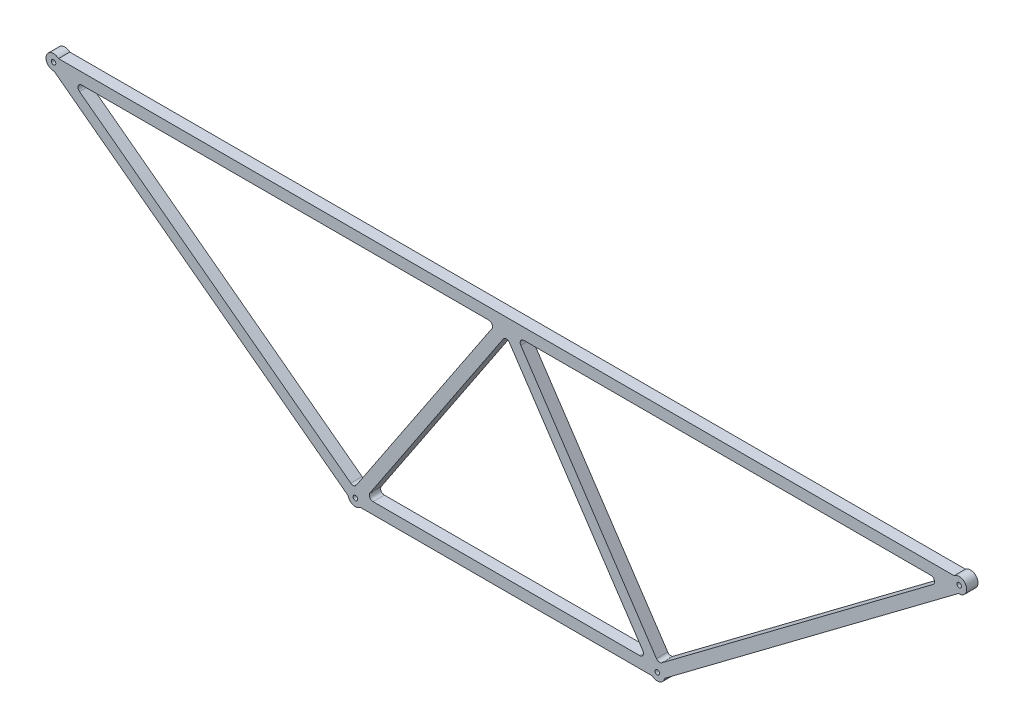
ISO-10303-21;
HEADER;
FILE_DESCRIPTION(('STEP AP214'),'2;1');
FILE_NAME('part.step','',(''),(''),'','','');
FILE_SCHEMA(('AUTOMOTIVE_DESIGN { 1 0 10303 214 1 1 1 1 }'));
ENDSEC;
DATA;
#1=APPLICATION_CONTEXT('core data for automotive mechanical design processes');
#2=APPLICATION_PROTOCOL_DEFINITION('international standard','automotive_design',2000,#1);
#3=PRODUCT_CONTEXT('',#1,'mechanical');
#4=PRODUCT('Part','Part','',(#3));
#5=PRODUCT_RELATED_PRODUCT_CATEGORY('part','',(#4));
#6=PRODUCT_DEFINITION_FORMATION('','',#4);
#7=PRODUCT_DEFINITION_CONTEXT('part definition',#1,'design');
#8=PRODUCT_DEFINITION('design','',#6,#7);
#9=PRODUCT_DEFINITION_SHAPE('','',#8);
#10=(LENGTH_UNIT() NAMED_UNIT(*) SI_UNIT(.MILLI.,.METRE.));
#11=(NAMED_UNIT(*) PLANE_ANGLE_UNIT() SI_UNIT($,.RADIAN.));
#12=(NAMED_UNIT(*) SI_UNIT($,.STERADIAN.) SOLID_ANGLE_UNIT());
#13=UNCERTAINTY_MEASURE_WITH_UNIT(LENGTH_MEASURE(1.E-05),#10,'distance_accuracy_value','');
#14=(GEOMETRIC_REPRESENTATION_CONTEXT(3) GLOBAL_UNCERTAINTY_ASSIGNED_CONTEXT((#13)) GLOBAL_UNIT_ASSIGNED_CONTEXT((#10,
#11,#12)) REPRESENTATION_CONTEXT('',''));
#15=CARTESIAN_POINT('',(0.,0.,0.));
#16=DIRECTION('',(0.,0.,1.));
#17=DIRECTION('',(1.,0.,0.));
#18=AXIS2_PLACEMENT_3D('',#15,#16,#17);
#19=CARTESIAN_POINT('',(204.5,-306.,7.5));
#20=DIRECTION('',(-0.600000000000043,0.799999999999968,0.));
#21=DIRECTION('',(-0.799999999999968,-0.600000000000043,0.));
#22=AXIS2_PLACEMENT_3D('',#19,#20,#21);
#23=PLANE('',#22);
#24=DIRECTION('',(0.,0.,-1.));
#25=VECTOR('',#24,1.);
#26=CARTESIAN_POINT('',(599.208497377831,-9.96862696659374,7.5));
#27=LINE('',#26,#25);
#28=CARTESIAN_POINT('',(599.208497377808,-9.9686269665919,7.5));
#29=VERTEX_POINT('',#28);
#30=CARTESIAN_POINT('',(599.208497377831,-9.96862696659372,-7.5));
#31=VERTEX_POINT('',#30);
#32=EDGE_CURVE('E222',#29,#31,#27,.T.);
#33=ORIENTED_EDGE('',*,*,#32,.F.);
#34=DIRECTION('',(0.799999999999949,0.600000000000067,0.));
#35=VECTOR('',#34,1.);
#36=CARTESIAN_POINT('',(204.5,-306.,7.5));
#37=LINE('',#36,#35);
#38=CARTESIAN_POINT('',(209.791502622129,-302.031373033402,7.5));
#39=VERTEX_POINT('',#38);
#40=EDGE_CURVE('E346',#39,#29,#37,.T.);
#41=ORIENTED_EDGE('',*,*,#40,.F.);
#42=DIRECTION('',(0.,0.,-1.));
#43=VECTOR('',#42,1.);
#44=CARTESIAN_POINT('',(209.791502622129,-302.031373033402,7.5));
#45=LINE('',#44,#43);
#46=CARTESIAN_POINT('',(209.791502622129,-302.031373033402,-7.5));
#47=VERTEX_POINT('',#46);
#48=EDGE_CURVE('E221',#47,#39,#45,.F.);
#49=ORIENTED_EDGE('',*,*,#48,.F.);
#50=DIRECTION('',(0.799999999999968,0.600000000000043,0.));
#51=VECTOR('',#50,1.);
#52=CARTESIAN_POINT('',(204.5,-306.,-7.5));
#53=LINE('',#52,#51);
#54=EDGE_CURVE('E218',#47,#31,#53,.T.);
#55=ORIENTED_EDGE('',*,*,#54,.T.);
#56=EDGE_LOOP('',(#33,#41,#49,#55));
#57=FACE_BOUND('',#56,.T.);
#58=ADVANCED_FACE('F44',(#57),#23,.F.);
#59=CARTESIAN_POINT('',(622.499999999983,7.50000000002226,7.5));
#60=DIRECTION('',(0.,-1.,0.));
#61=DIRECTION('',(1.,0.,0.));
#62=AXIS2_PLACEMENT_3D('',#59,#60,#61);
#63=PLANE('',#62);
#64=DIRECTION('',(0.,0.,-1.));
#65=VECTOR('',#64,1.);
#66=CARTESIAN_POINT('',(593.385621722363,7.50000000002174,7.5));
#67=LINE('',#66,#65);
#68=CARTESIAN_POINT('',(593.385621722363,7.50000000002174,-7.5));
#69=VERTEX_POINT('',#68);
#70=CARTESIAN_POINT('',(593.385621722363,7.50000000002174,7.5));
#71=VERTEX_POINT('',#70);
#72=EDGE_CURVE('E388',#69,#71,#67,.F.);
#73=ORIENTED_EDGE('',*,*,#72,.F.);
#74=DIRECTION('',(-1.,0.,0.));
#75=VECTOR('',#74,1.);
#76=CARTESIAN_POINT('',(622.499999999983,7.50000000002226,-7.5));
#77=LINE('',#76,#75);
#78=CARTESIAN_POINT('',(-593.385621722339,7.50000000000051,-7.5));
#79=VERTEX_POINT('',#78);
#80=EDGE_CURVE('E227',#69,#79,#77,.T.);
#81=ORIENTED_EDGE('',*,*,#80,.T.);
#82=DIRECTION('',(0.,0.,-1.));
#83=VECTOR('',#82,1.);
#84=CARTESIAN_POINT('',(-593.385621722339,7.50000000000051,7.5));
#85=LINE('',#84,#83);
#86=CARTESIAN_POINT('',(-593.385621722339,7.50000000000051,7.5));
#87=VERTEX_POINT('',#86);
#88=EDGE_CURVE('E379',#79,#87,#85,.F.);
#89=ORIENTED_EDGE('',*,*,#88,.T.);
#90=DIRECTION('',(-1.,0.,0.));
#91=VECTOR('',#90,1.);
#92=CARTESIAN_POINT('',(622.499999999983,7.50000000002226,7.5));
#93=LINE('',#92,#91);
#94=EDGE_CURVE('E354',#71,#87,#93,.T.);
#95=ORIENTED_EDGE('',*,*,#94,.F.);
#96=EDGE_LOOP('',(#73,#81,#89,#95));
#97=FACE_BOUND('',#96,.T.);
#98=ADVANCED_FACE('F567',(#97),#63,.F.);
#99=CARTESIAN_POINT('',(200.,-307.5,7.5));
#100=DIRECTION('',(0.,1.,0.));
#101=DIRECTION('',(-1.,0.,0.));
#102=AXIS2_PLACEMENT_3D('',#99,#100,#101);
#103=PLANE('',#102);
#104=DIRECTION('',(0.,0.,-1.));
#105=VECTOR('',#104,1.);
#106=CARTESIAN_POINT('',(193.385621722338,-307.5,7.5));
#107=LINE('',#106,#105);
#108=CARTESIAN_POINT('',(193.385621722339,-307.5,7.5));
#109=VERTEX_POINT('',#108);
#110=CARTESIAN_POINT('',(193.385621722338,-307.5,-7.5));
#111=VERTEX_POINT('',#110);
#112=EDGE_CURVE('E259',#109,#111,#107,.T.);
#113=ORIENTED_EDGE('',*,*,#112,.F.);
#114=DIRECTION('',(1.,0.,0.));
#115=VECTOR('',#114,1.);
#116=CARTESIAN_POINT('',(-200.,-307.5,7.5));
#117=LINE('',#116,#115);
#118=CARTESIAN_POINT('',(-193.385621722329,-307.499999999991,7.5));
#119=VERTEX_POINT('',#118);
#120=EDGE_CURVE('E359',#119,#109,#117,.T.);
#121=ORIENTED_EDGE('',*,*,#120,.F.);
#122=DIRECTION('',(0.,0.,-1.));
#123=VECTOR('',#122,1.);
#124=CARTESIAN_POINT('',(-193.385621722329,-307.499999999991,7.5));
#125=LINE('',#124,#123);
#126=CARTESIAN_POINT('',(-193.385621722329,-307.499999999991,-7.5));
#127=VERTEX_POINT('',#126);
#128=EDGE_CURVE('E383',#127,#119,#125,.F.);
#129=ORIENTED_EDGE('',*,*,#128,.F.);
#130=DIRECTION('',(1.,0.,0.));
#131=VECTOR('',#130,1.);
#132=CARTESIAN_POINT('',(200.,-307.5,-7.5));
#133=LINE('',#132,#131);
#134=EDGE_CURVE('E351',#127,#111,#133,.T.);
#135=ORIENTED_EDGE('',*,*,#134,.T.);
#136=EDGE_LOOP('',(#113,#121,#129,#135));
#137=FACE_BOUND('',#136,.T.);
#138=ADVANCED_FACE('F574',(#137),#103,.F.);
#139=CARTESIAN_POINT('',(-204.5,-306.,7.5));
#140=DIRECTION('',(0.600000000000002,0.799999999999999,0.));
#141=DIRECTION('',(-0.799999999999999,0.600000000000002,0.));
#142=AXIS2_PLACEMENT_3D('',#139,#140,#141);
#143=PLANE('',#142);
#144=DIRECTION('',(0.,0.,-1.));
#145=VECTOR('',#144,1.);
#146=CARTESIAN_POINT('',(-209.791502622129,-302.031373033403,7.5));
#147=LINE('',#146,#145);
#148=CARTESIAN_POINT('',(-209.791502622129,-302.031373033403,7.5));
#149=VERTEX_POINT('',#148);
#150=CARTESIAN_POINT('',(-209.791502622129,-302.031373033403,-7.5));
#151=VERTEX_POINT('',#150);
#152=EDGE_CURVE('E271',#149,#151,#147,.T.);
#153=ORIENTED_EDGE('',*,*,#152,.F.);
#154=DIRECTION('',(0.8,-0.6,0.));
#155=VECTOR('',#154,1.);
#156=CARTESIAN_POINT('',(-622.5,7.49999999999999,7.5));
#157=LINE('',#156,#155);
#158=CARTESIAN_POINT('',(-599.208497377869,-9.96862696659684,7.5));
#159=VERTEX_POINT('',#158);
#160=EDGE_CURVE('E352',#159,#149,#157,.T.);
#161=ORIENTED_EDGE('',*,*,#160,.F.);
#162=DIRECTION('',(0.,0.,-1.));
#163=VECTOR('',#162,1.);
#164=CARTESIAN_POINT('',(-599.208497377869,-9.96862696659683,7.5));
#165=LINE('',#164,#163);
#166=CARTESIAN_POINT('',(-599.208497377869,-9.96862696659678,-7.5));
#167=VERTEX_POINT('',#166);
#168=EDGE_CURVE('E372',#159,#167,#165,.T.);
#169=ORIENTED_EDGE('',*,*,#168,.T.);
#170=DIRECTION('',(0.799999999999999,-0.600000000000002,0.));
#171=VECTOR('',#170,1.);
#172=CARTESIAN_POINT('',(-204.5,-306.,-7.5));
#173=LINE('',#172,#171);
#174=EDGE_CURVE('E368',#167,#151,#173,.T.);
#175=ORIENTED_EDGE('',*,*,#174,.T.);
#176=EDGE_LOOP('',(#153,#161,#169,#175));
#177=FACE_BOUND('',#176,.T.);
#178=ADVANCED_FACE('F588',(#177),#143,.F.);
#179=CARTESIAN_POINT('',(-600.,0.,7.5));
#180=DIRECTION('',(0.,0.,-1.));
#181=DIRECTION('',(-1.,0.,0.));
#182=AXIS2_PLACEMENT_3D('',#179,#180,#181);
#183=CYLINDRICAL_SURFACE('',#182,9.99999999999998);
#184=CARTESIAN_POINT('',(-600.,0.,-7.5));
#185=DIRECTION('',(0.,0.,1.));
#186=DIRECTION('',(1.,0.,0.));
#187=AXIS2_PLACEMENT_3D('',#184,#185,#186);
#188=CIRCLE('',#187,9.99999999999998);
#189=EDGE_CURVE('E362',#79,#167,#188,.T.);
#190=ORIENTED_EDGE('',*,*,#189,.T.);
#191=ORIENTED_EDGE('',*,*,#168,.F.);
#192=CARTESIAN_POINT('',(-600.,0.,7.5));
#193=DIRECTION('',(0.,0.,1.));
#194=DIRECTION('',(1.,0.,0.));
#195=AXIS2_PLACEMENT_3D('',#192,#193,#194);
#196=CIRCLE('',#195,9.99999999999998);
#197=EDGE_CURVE('E371',#87,#159,#196,.T.);
#198=ORIENTED_EDGE('',*,*,#197,.F.);
#199=ORIENTED_EDGE('',*,*,#88,.F.);
#200=EDGE_LOOP('',(#190,#191,#198,#199));
#201=FACE_BOUND('',#200,.T.);
#202=ADVANCED_FACE('F578',(#201),#183,.T.);
#203=CARTESIAN_POINT('',(-600.,0.,7.5));
#204=DIRECTION('',(0.,0.,1.));
#205=DIRECTION('',(1.,0.,0.));
#206=AXIS2_PLACEMENT_3D('',#203,#204,#205);
#207=PLANE('',#206);
#208=ORIENTED_EDGE('',*,*,#197,.T.);
#209=ORIENTED_EDGE('',*,*,#160,.T.);
#210=CARTESIAN_POINT('',(-200.,-300.,7.5));
#211=DIRECTION('',(0.,0.,1.));
#212=DIRECTION('',(1.,0.,0.));
#213=AXIS2_PLACEMENT_3D('',#210,#211,#212);
#214=CIRCLE('',#213,10.);
#215=EDGE_CURVE('E266',#149,#119,#214,.T.);
#216=ORIENTED_EDGE('',*,*,#215,.T.);
#217=ORIENTED_EDGE('',*,*,#120,.T.);
#218=CARTESIAN_POINT('',(200.,-300.,7.5));
#219=DIRECTION('',(0.,0.,1.));
#220=DIRECTION('',(1.,0.,0.));
#221=AXIS2_PLACEMENT_3D('',#218,#219,#220);
#222=CIRCLE('',#221,10.);
#223=EDGE_CURVE('E244',#109,#39,#222,.T.);
#224=ORIENTED_EDGE('',*,*,#223,.T.);
#225=ORIENTED_EDGE('',*,*,#40,.T.);
#226=CARTESIAN_POINT('',(600.,0.,7.5));
#227=DIRECTION('',(0.,0.,1.));
#228=DIRECTION('',(1.,0.,0.));
#229=AXIS2_PLACEMENT_3D('',#226,#227,#228);
#230=CIRCLE('',#229,9.99999999999998);
#231=EDGE_CURVE('E239',#29,#71,#230,.T.);
#232=ORIENTED_EDGE('',*,*,#231,.T.);
#233=ORIENTED_EDGE('',*,*,#94,.T.);
#234=EDGE_LOOP('',(#208,#209,#216,#217,#224,#225,#232,#233));
#235=FACE_BOUND('',#234,.T.);
#236=CARTESIAN_POINT('',(600.,0.,7.5));
#237=DIRECTION('',(0.,0.,1.));
#238=DIRECTION('',(1.,0.,0.));
#239=AXIS2_PLACEMENT_3D('',#236,#237,#238);
#240=CIRCLE('',#239,3.00000000000005);
#241=CARTESIAN_POINT('',(603.,0.,7.5));
#242=VERTEX_POINT('',#241);
#243=EDGE_CURVE('E253',#242,#242,#240,.T.);
#244=ORIENTED_EDGE('',*,*,#243,.F.);
#245=EDGE_LOOP('',(#244));
#246=FACE_BOUND('',#245,.T.);
#247=CARTESIAN_POINT('',(200.,-300.,7.5));
#248=DIRECTION('',(0.,0.,1.));
#249=DIRECTION('',(1.,0.,0.));
#250=AXIS2_PLACEMENT_3D('',#247,#248,#249);
#251=CIRCLE('',#250,3.00000000000002);
#252=CARTESIAN_POINT('',(203.,-300.,7.5));
#253=VERTEX_POINT('',#252);
#254=EDGE_CURVE('E410',#253,#253,#251,.T.);
#255=ORIENTED_EDGE('',*,*,#254,.F.);
#256=EDGE_LOOP('',(#255));
#257=FACE_BOUND('',#256,.T.);
#258=CARTESIAN_POINT('',(-200.,-300.,7.5));
#259=DIRECTION('',(0.,0.,1.));
#260=DIRECTION('',(1.,0.,0.));
#261=AXIS2_PLACEMENT_3D('',#258,#259,#260);
#262=CIRCLE('',#261,3.00000000000002);
#263=CARTESIAN_POINT('',(-197.,-300.,7.5));
#264=VERTEX_POINT('',#263);
#265=EDGE_CURVE('E401',#264,#264,#262,.T.);
#266=ORIENTED_EDGE('',*,*,#265,.F.);
#267=EDGE_LOOP('',(#266));
#268=FACE_BOUND('',#267,.T.);
#269=CARTESIAN_POINT('',(-600.,0.,7.5));
#270=DIRECTION('',(0.,0.,1.));
#271=DIRECTION('',(1.,0.,0.));
#272=AXIS2_PLACEMENT_3D('',#269,#270,#271);
#273=CIRCLE('',#272,2.99999999999994);
#274=CARTESIAN_POINT('',(-597.,0.,7.5));
#275=VERTEX_POINT('',#274);
#276=EDGE_CURVE('E398',#275,#275,#273,.T.);
#277=ORIENTED_EDGE('',*,*,#276,.F.);
#278=EDGE_LOOP('',(#277));
#279=FACE_BOUND('',#278,.T.);
#280=DIRECTION('',(0.8,-0.6,0.));
#281=VECTOR('',#280,1.);
#282=CARTESIAN_POINT('',(-577.5,-7.50000000000001,7.5));
#283=LINE('',#282,#281);
#284=CARTESIAN_POINT('',(-565.5,-16.5,7.5));
#285=VERTEX_POINT('',#284);
#286=CARTESIAN_POINT('',(-206.070975765178,-286.071768176117,7.5));
#287=VERTEX_POINT('',#286);
#288=EDGE_CURVE('E285',#285,#287,#283,.T.);
#289=ORIENTED_EDGE('',*,*,#288,.F.);
#290=CARTESIAN_POINT('',(-562.5,-12.5,7.5));
#291=DIRECTION('',(0.,0.,1.));
#292=DIRECTION('',(1.,0.,0.));
#293=AXIS2_PLACEMENT_3D('',#290,#291,#292);
#294=CIRCLE('',#293,5.);
#295=CARTESIAN_POINT('',(-562.5,-7.5,7.5));
#296=VERTEX_POINT('',#295);
#297=EDGE_CURVE('E480',#285,#296,#294,.F.);
#298=ORIENTED_EDGE('',*,*,#297,.T.);
#299=DIRECTION('',(-1.,0.,0.));
#300=VECTOR('',#299,1.);
#301=CARTESIAN_POINT('',(-14.0138781886598,-7.49999999999993,7.5));
#302=LINE('',#301,#300);
#303=CARTESIAN_POINT('',(-23.3564636477664,-7.49999999999993,7.5));
#304=VERTEX_POINT('',#303);
#305=EDGE_CURVE('E276',#304,#296,#302,.T.);
#306=ORIENTED_EDGE('',*,*,#305,.F.);
#307=CARTESIAN_POINT('',(-23.3564636477664,-12.4999999999999,7.5));
#308=DIRECTION('',(0.,0.,1.));
#309=DIRECTION('',(1.,0.,0.));
#310=AXIS2_PLACEMENT_3D('',#307,#308,#309);
#311=CIRCLE('',#310,5.);
#312=CARTESIAN_POINT('',(-19.1962121760772,-15.2735009811261,7.5));
#313=VERTEX_POINT('',#312);
#314=EDGE_CURVE('E494',#304,#313,#311,.F.);
#315=ORIENTED_EDGE('',*,*,#314,.T.);
#316=DIRECTION('',(0.554700196225229,0.832050294337844,0.));
#317=VECTOR('',#316,1.);
#318=CARTESIAN_POINT('',(-201.842585459107,-289.24306090567,7.5));
#319=LINE('',#318,#317);
#320=CARTESIAN_POINT('',(-198.910724293488,-284.845269157243,7.5));
#321=VERTEX_POINT('',#320);
#322=EDGE_CURVE('E288',#321,#313,#319,.T.);
#323=ORIENTED_EDGE('',*,*,#322,.F.);
#324=CARTESIAN_POINT('',(-203.070975765178,-282.071768176117,7.5));
#325=DIRECTION('',(0.,0.,1.));
#326=DIRECTION('',(1.,0.,0.));
#327=AXIS2_PLACEMENT_3D('',#324,#325,#326);
#328=CIRCLE('',#327,5.);
#329=EDGE_CURVE('E11',#321,#287,#328,.F.);
#330=ORIENTED_EDGE('',*,*,#329,.T.);
#331=EDGE_LOOP('',(#289,#298,#306,#315,#323,#330));
#332=FACE_BOUND('',#331,.T.);
#333=DIRECTION('',(0.554700196225229,-0.832050294337844,0.));
#334=VECTOR('',#333,1.);
#335=CARTESIAN_POINT('',(14.0138781886598,-7.49999999999995,7.5));
#336=LINE('',#335,#334);
#337=CARTESIAN_POINT('',(19.1962121760772,-15.2735009811261,7.5));
#338=VERTEX_POINT('',#337);
#339=CARTESIAN_POINT('',(198.910724293488,-284.845269157243,7.5));
#340=VERTEX_POINT('',#339);
#341=EDGE_CURVE('E307',#338,#340,#336,.T.);
#342=ORIENTED_EDGE('',*,*,#341,.F.);
#343=CARTESIAN_POINT('',(23.3564636477664,-12.5,7.5));
#344=DIRECTION('',(0.,0.,1.));
#345=DIRECTION('',(1.,0.,0.));
#346=AXIS2_PLACEMENT_3D('',#343,#344,#345);
#347=CIRCLE('',#346,5.);
#348=CARTESIAN_POINT('',(23.3564636477664,-7.49999999999995,7.5));
#349=VERTEX_POINT('',#348);
#350=EDGE_CURVE('E487',#338,#349,#347,.F.);
#351=ORIENTED_EDGE('',*,*,#350,.T.);
#352=DIRECTION('',(-1.,0.,0.));
#353=VECTOR('',#352,1.);
#354=CARTESIAN_POINT('',(577.5,-7.50000000000001,7.5));
#355=LINE('',#354,#353);
#356=CARTESIAN_POINT('',(562.5,-7.5,7.5));
#357=VERTEX_POINT('',#356);
#358=EDGE_CURVE('E303',#357,#349,#355,.T.);
#359=ORIENTED_EDGE('',*,*,#358,.F.);
#360=CARTESIAN_POINT('',(562.5,-12.5,7.5));
#361=DIRECTION('',(0.,0.,1.));
#362=DIRECTION('',(1.,0.,0.));
#363=AXIS2_PLACEMENT_3D('',#360,#361,#362);
#364=CIRCLE('',#363,5.);
#365=CARTESIAN_POINT('',(565.5,-16.5,7.5));
#366=VERTEX_POINT('',#365);
#367=EDGE_CURVE('E483',#357,#366,#364,.F.);
#368=ORIENTED_EDGE('',*,*,#367,.T.);
#369=DIRECTION('',(0.8,0.6,0.));
#370=VECTOR('',#369,1.);
#371=CARTESIAN_POINT('',(201.842585459107,-289.24306090567,7.5));
#372=LINE('',#371,#370);
#373=CARTESIAN_POINT('',(206.070975765178,-286.071768176117,7.5));
#374=VERTEX_POINT('',#373);
#375=EDGE_CURVE('E315',#374,#366,#372,.T.);
#376=ORIENTED_EDGE('',*,*,#375,.F.);
#377=CARTESIAN_POINT('',(203.070975765178,-282.071768176117,7.5));
#378=DIRECTION('',(0.,0.,1.));
#379=DIRECTION('',(1.,0.,0.));
#380=AXIS2_PLACEMENT_3D('',#377,#378,#379);
#381=CIRCLE('',#380,5.);
#382=EDGE_CURVE('E515',#374,#340,#381,.F.);
#383=ORIENTED_EDGE('',*,*,#382,.T.);
#384=EDGE_LOOP('',(#342,#351,#359,#368,#376,#383));
#385=FACE_BOUND('',#384,.T.);
#386=DIRECTION('',(-0.554700196225229,-0.832050294337844,0.));
#387=VECTOR('',#386,1.);
#388=CARTESIAN_POINT('',(-185.98612181134,-292.5,7.5));
#389=LINE('',#388,#387);
#390=CARTESIAN_POINT('',(-4.16025147168927,-19.7611944905239,7.5));
#391=VERTEX_POINT('',#390);
#392=CARTESIAN_POINT('',(-180.803787823923,-284.726499018874,7.5));
#393=VERTEX_POINT('',#392);
#394=EDGE_CURVE('E332',#391,#393,#389,.T.);
#395=ORIENTED_EDGE('',*,*,#394,.F.);
#396=CARTESIAN_POINT('',(0.,-22.53469547165,7.5));
#397=DIRECTION('',(0.,0.,1.));
#398=DIRECTION('',(1.,0.,0.));
#399=AXIS2_PLACEMENT_3D('',#396,#397,#398);
#400=CIRCLE('',#399,5.);
#401=CARTESIAN_POINT('',(4.16025147168923,-19.7611944905238,7.5));
#402=VERTEX_POINT('',#401);
#403=EDGE_CURVE('E504',#391,#402,#400,.F.);
#404=ORIENTED_EDGE('',*,*,#403,.T.);
#405=DIRECTION('',(-0.554700196225229,0.832050294337844,0.));
#406=VECTOR('',#405,1.);
#407=CARTESIAN_POINT('',(0.,-13.52081728299,7.5));
#408=LINE('',#407,#406);
#409=CARTESIAN_POINT('',(180.803787823923,-284.726499018874,7.5));
#410=VERTEX_POINT('',#409);
#411=EDGE_CURVE('E330',#410,#402,#408,.T.);
#412=ORIENTED_EDGE('',*,*,#411,.F.);
#413=CARTESIAN_POINT('',(176.643536352233,-287.5,7.5));
#414=DIRECTION('',(0.,0.,1.));
#415=DIRECTION('',(1.,0.,0.));
#416=AXIS2_PLACEMENT_3D('',#413,#414,#415);
#417=CIRCLE('',#416,5.);
#418=CARTESIAN_POINT('',(176.643536352233,-292.5,7.5));
#419=VERTEX_POINT('',#418);
#420=EDGE_CURVE('E64',#410,#419,#417,.F.);
#421=ORIENTED_EDGE('',*,*,#420,.T.);
#422=DIRECTION('',(1.,0.,0.));
#423=VECTOR('',#422,1.);
#424=CARTESIAN_POINT('',(-185.98612181134,-292.5,7.5));
#425=LINE('',#424,#423);
#426=CARTESIAN_POINT('',(-176.643536352233,-292.5,7.5));
#427=VERTEX_POINT('',#426);
#428=EDGE_CURVE('E232',#427,#419,#425,.T.);
#429=ORIENTED_EDGE('',*,*,#428,.F.);
#430=CARTESIAN_POINT('',(-176.643536352233,-287.5,7.5));
#431=DIRECTION('',(0.,0.,1.));
#432=DIRECTION('',(1.,0.,0.));
#433=AXIS2_PLACEMENT_3D('',#430,#431,#432);
#434=CIRCLE('',#433,5.);
#435=EDGE_CURVE('E520',#427,#393,#434,.F.);
#436=ORIENTED_EDGE('',*,*,#435,.T.);
#437=EDGE_LOOP('',(#395,#404,#412,#421,#429,#436));
#438=FACE_BOUND('',#437,.T.);
#439=ADVANCED_FACE('F534',(#235,#246,#257,#268,#279,#332,#385,#438),#207,.T.);
#440=CARTESIAN_POINT('',(-600.,0.,-7.5));
#441=DIRECTION('',(0.,0.,1.));
#442=DIRECTION('',(1.,0.,0.));
#443=AXIS2_PLACEMENT_3D('',#440,#441,#442);
#444=PLANE('',#443);
#445=CARTESIAN_POINT('',(600.,0.,-7.5));
#446=DIRECTION('',(0.,0.,1.));
#447=DIRECTION('',(1.,0.,0.));
#448=AXIS2_PLACEMENT_3D('',#445,#446,#447);
#449=CIRCLE('',#448,3.00000000000005);
#450=CARTESIAN_POINT('',(603.,0.,-7.5));
#451=VERTEX_POINT('',#450);
#452=EDGE_CURVE('E408',#451,#451,#449,.T.);
#453=ORIENTED_EDGE('',*,*,#452,.T.);
#454=EDGE_LOOP('',(#453));
#455=FACE_BOUND('',#454,.T.);
#456=CARTESIAN_POINT('',(200.,-300.,-7.5));
#457=DIRECTION('',(0.,0.,1.));
#458=DIRECTION('',(1.,0.,0.));
#459=AXIS2_PLACEMENT_3D('',#456,#457,#458);
#460=CIRCLE('',#459,3.00000000000002);
#461=CARTESIAN_POINT('',(203.,-300.,-7.5));
#462=VERTEX_POINT('',#461);
#463=EDGE_CURVE('E404',#462,#462,#460,.T.);
#464=ORIENTED_EDGE('',*,*,#463,.T.);
#465=EDGE_LOOP('',(#464));
#466=FACE_BOUND('',#465,.T.);
#467=CARTESIAN_POINT('',(-200.,-300.,-7.5));
#468=DIRECTION('',(0.,0.,1.));
#469=DIRECTION('',(1.,0.,0.));
#470=AXIS2_PLACEMENT_3D('',#467,#468,#469);
#471=CIRCLE('',#470,3.00000000000002);
#472=CARTESIAN_POINT('',(-197.,-300.,-7.5));
#473=VERTEX_POINT('',#472);
#474=EDGE_CURVE('E399',#473,#473,#471,.T.);
#475=ORIENTED_EDGE('',*,*,#474,.T.);
#476=EDGE_LOOP('',(#475));
#477=FACE_BOUND('',#476,.T.);
#478=CARTESIAN_POINT('',(-600.,0.,-7.5));
#479=DIRECTION('',(0.,0.,1.));
#480=DIRECTION('',(1.,0.,0.));
#481=AXIS2_PLACEMENT_3D('',#478,#479,#480);
#482=CIRCLE('',#481,2.99999999999994);
#483=CARTESIAN_POINT('',(-597.,0.,-7.5));
#484=VERTEX_POINT('',#483);
#485=EDGE_CURVE('E393',#484,#484,#482,.T.);
#486=ORIENTED_EDGE('',*,*,#485,.T.);
#487=EDGE_LOOP('',(#486));
#488=FACE_BOUND('',#487,.T.);
#489=ORIENTED_EDGE('',*,*,#174,.F.);
#490=ORIENTED_EDGE('',*,*,#189,.F.);
#491=ORIENTED_EDGE('',*,*,#80,.F.);
#492=CARTESIAN_POINT('',(600.,0.,-7.5));
#493=DIRECTION('',(0.,0.,1.));
#494=DIRECTION('',(1.,0.,0.));
#495=AXIS2_PLACEMENT_3D('',#492,#493,#494);
#496=CIRCLE('',#495,9.99999999999998);
#497=EDGE_CURVE('E240',#31,#69,#496,.T.);
#498=ORIENTED_EDGE('',*,*,#497,.F.);
#499=ORIENTED_EDGE('',*,*,#54,.F.);
#500=CARTESIAN_POINT('',(200.,-300.,-7.5));
#501=DIRECTION('',(0.,0.,1.));
#502=DIRECTION('',(1.,0.,0.));
#503=AXIS2_PLACEMENT_3D('',#500,#501,#502);
#504=CIRCLE('',#503,10.);
#505=EDGE_CURVE('E258',#111,#47,#504,.T.);
#506=ORIENTED_EDGE('',*,*,#505,.F.);
#507=ORIENTED_EDGE('',*,*,#134,.F.);
#508=CARTESIAN_POINT('',(-200.,-300.,-7.5));
#509=DIRECTION('',(0.,0.,1.));
#510=DIRECTION('',(1.,0.,0.));
#511=AXIS2_PLACEMENT_3D('',#508,#509,#510);
#512=CIRCLE('',#511,10.);
#513=EDGE_CURVE('E270',#151,#127,#512,.T.);
#514=ORIENTED_EDGE('',*,*,#513,.F.);
#515=EDGE_LOOP('',(#489,#490,#491,#498,#499,#506,#507,#514));
#516=FACE_BOUND('',#515,.T.);
#517=DIRECTION('',(0.554700196225229,0.832050294337844,0.));
#518=VECTOR('',#517,1.);
#519=CARTESIAN_POINT('',(-201.842585459107,-289.24306090567,-7.5));
#520=LINE('',#519,#518);
#521=CARTESIAN_POINT('',(-198.910724293488,-284.845269157243,-7.5));
#522=VERTEX_POINT('',#521);
#523=CARTESIAN_POINT('',(-19.1962121760772,-15.2735009811261,-7.5));
#524=VERTEX_POINT('',#523);
#525=EDGE_CURVE('E283',#522,#524,#520,.T.);
#526=ORIENTED_EDGE('',*,*,#525,.T.);
#527=CARTESIAN_POINT('',(-23.3564636477664,-12.4999999999999,-7.5));
#528=DIRECTION('',(0.,0.,1.));
#529=DIRECTION('',(1.,0.,0.));
#530=AXIS2_PLACEMENT_3D('',#527,#528,#529);
#531=CIRCLE('',#530,5.);
#532=CARTESIAN_POINT('',(-23.3564636477664,-7.49999999999993,-7.5));
#533=VERTEX_POINT('',#532);
#534=EDGE_CURVE('E495',#524,#533,#531,.T.);
#535=ORIENTED_EDGE('',*,*,#534,.T.);
#536=DIRECTION('',(-1.,0.,0.));
#537=VECTOR('',#536,1.);
#538=CARTESIAN_POINT('',(-14.0138781886598,-7.49999999999993,-7.5));
#539=LINE('',#538,#537);
#540=CARTESIAN_POINT('',(-562.5,-7.5,-7.5));
#541=VERTEX_POINT('',#540);
#542=EDGE_CURVE('E279',#533,#541,#539,.T.);
#543=ORIENTED_EDGE('',*,*,#542,.T.);
#544=CARTESIAN_POINT('',(-562.5,-12.5,-7.5));
#545=DIRECTION('',(0.,0.,1.));
#546=DIRECTION('',(1.,0.,0.));
#547=AXIS2_PLACEMENT_3D('',#544,#545,#546);
#548=CIRCLE('',#547,5.);
#549=CARTESIAN_POINT('',(-565.5,-16.5,-7.5));
#550=VERTEX_POINT('',#549);
#551=EDGE_CURVE('E475',#541,#550,#548,.T.);
#552=ORIENTED_EDGE('',*,*,#551,.T.);
#553=DIRECTION('',(0.8,-0.6,0.));
#554=VECTOR('',#553,1.);
#555=CARTESIAN_POINT('',(-577.5,-7.50000000000001,-7.5));
#556=LINE('',#555,#554);
#557=CARTESIAN_POINT('',(-206.070975765178,-286.071768176117,-7.5));
#558=VERTEX_POINT('',#557);
#559=EDGE_CURVE('E299',#550,#558,#556,.T.);
#560=ORIENTED_EDGE('',*,*,#559,.T.);
#561=CARTESIAN_POINT('',(-203.070975765178,-282.071768176117,-7.5));
#562=DIRECTION('',(0.,0.,1.));
#563=DIRECTION('',(1.,0.,0.));
#564=AXIS2_PLACEMENT_3D('',#561,#562,#563);
#565=CIRCLE('',#564,5.);
#566=EDGE_CURVE('E53',#558,#522,#565,.T.);
#567=ORIENTED_EDGE('',*,*,#566,.T.);
#568=EDGE_LOOP('',(#526,#535,#543,#552,#560,#567));
#569=FACE_BOUND('',#568,.T.);
#570=DIRECTION('',(1.,0.,0.));
#571=VECTOR('',#570,1.);
#572=CARTESIAN_POINT('',(-185.98612181134,-292.5,-7.5));
#573=LINE('',#572,#571);
#574=CARTESIAN_POINT('',(-176.643536352233,-292.5,-7.5));
#575=VERTEX_POINT('',#574);
#576=CARTESIAN_POINT('',(176.643536352233,-292.5,-7.5));
#577=VERTEX_POINT('',#576);
#578=EDGE_CURVE('E335',#575,#577,#573,.T.);
#579=ORIENTED_EDGE('',*,*,#578,.T.);
#580=CARTESIAN_POINT('',(176.643536352233,-287.5,-7.5));
#581=DIRECTION('',(0.,0.,1.));
#582=DIRECTION('',(1.,0.,0.));
#583=AXIS2_PLACEMENT_3D('',#580,#581,#582);
#584=CIRCLE('',#583,5.);
#585=CARTESIAN_POINT('',(180.803787823923,-284.726499018874,-7.5));
#586=VERTEX_POINT('',#585);
#587=EDGE_CURVE('E503',#577,#586,#584,.T.);
#588=ORIENTED_EDGE('',*,*,#587,.T.);
#589=DIRECTION('',(-0.554700196225229,0.832050294337844,0.));
#590=VECTOR('',#589,1.);
#591=CARTESIAN_POINT('',(0.,-13.52081728299,-7.5));
#592=LINE('',#591,#590);
#593=CARTESIAN_POINT('',(4.16025147168923,-19.7611944905238,-7.5));
#594=VERTEX_POINT('',#593);
#595=EDGE_CURVE('E316',#586,#594,#592,.T.);
#596=ORIENTED_EDGE('',*,*,#595,.T.);
#597=CARTESIAN_POINT('',(0.,-22.53469547165,-7.5));
#598=DIRECTION('',(0.,0.,1.));
#599=DIRECTION('',(1.,0.,0.));
#600=AXIS2_PLACEMENT_3D('',#597,#598,#599);
#601=CIRCLE('',#600,5.);
#602=CARTESIAN_POINT('',(-4.16025147168927,-19.7611944905239,-7.5));
#603=VERTEX_POINT('',#602);
#604=EDGE_CURVE('E499',#594,#603,#601,.T.);
#605=ORIENTED_EDGE('',*,*,#604,.T.);
#606=DIRECTION('',(-0.554700196225229,-0.832050294337844,0.));
#607=VECTOR('',#606,1.);
#608=CARTESIAN_POINT('',(-185.98612181134,-292.5,-7.5));
#609=LINE('',#608,#607);
#610=CARTESIAN_POINT('',(-180.803787823923,-284.726499018874,-7.5));
#611=VERTEX_POINT('',#610);
#612=EDGE_CURVE('E342',#603,#611,#609,.T.);
#613=ORIENTED_EDGE('',*,*,#612,.T.);
#614=CARTESIAN_POINT('',(-176.643536352233,-287.5,-7.5));
#615=DIRECTION('',(0.,0.,1.));
#616=DIRECTION('',(1.,0.,0.));
#617=AXIS2_PLACEMENT_3D('',#614,#615,#616);
#618=CIRCLE('',#617,5.);
#619=EDGE_CURVE('E513',#611,#575,#618,.T.);
#620=ORIENTED_EDGE('',*,*,#619,.T.);
#621=EDGE_LOOP('',(#579,#588,#596,#605,#613,#620));
#622=FACE_BOUND('',#621,.T.);
#623=DIRECTION('',(0.8,0.6,0.));
#624=VECTOR('',#623,1.);
#625=CARTESIAN_POINT('',(201.842585459107,-289.24306090567,-7.5));
#626=LINE('',#625,#624);
#627=CARTESIAN_POINT('',(206.070975765178,-286.071768176117,-7.5));
#628=VERTEX_POINT('',#627);
#629=CARTESIAN_POINT('',(565.5,-16.5,-7.5));
#630=VERTEX_POINT('',#629);
#631=EDGE_CURVE('E306',#628,#630,#626,.T.);
#632=ORIENTED_EDGE('',*,*,#631,.T.);
#633=CARTESIAN_POINT('',(562.5,-12.5,-7.5));
#634=DIRECTION('',(0.,0.,1.));
#635=DIRECTION('',(1.,0.,0.));
#636=AXIS2_PLACEMENT_3D('',#633,#634,#635);
#637=CIRCLE('',#636,5.);
#638=CARTESIAN_POINT('',(562.5,-7.5,-7.5));
#639=VERTEX_POINT('',#638);
#640=EDGE_CURVE('E477',#630,#639,#637,.T.);
#641=ORIENTED_EDGE('',*,*,#640,.T.);
#642=DIRECTION('',(-1.,0.,0.));
#643=VECTOR('',#642,1.);
#644=CARTESIAN_POINT('',(577.5,-7.50000000000001,-7.5));
#645=LINE('',#644,#643);
#646=CARTESIAN_POINT('',(23.3564636477664,-7.49999999999995,-7.5));
#647=VERTEX_POINT('',#646);
#648=EDGE_CURVE('E295',#639,#647,#645,.T.);
#649=ORIENTED_EDGE('',*,*,#648,.T.);
#650=CARTESIAN_POINT('',(23.3564636477664,-12.5,-7.5));
#651=DIRECTION('',(0.,0.,1.));
#652=DIRECTION('',(1.,0.,0.));
#653=AXIS2_PLACEMENT_3D('',#650,#651,#652);
#654=CIRCLE('',#653,5.);
#655=CARTESIAN_POINT('',(19.1962121760772,-15.2735009811261,-7.5));
#656=VERTEX_POINT('',#655);
#657=EDGE_CURVE('E486',#647,#656,#654,.T.);
#658=ORIENTED_EDGE('',*,*,#657,.T.);
#659=DIRECTION('',(0.554700196225229,-0.832050294337844,0.));
#660=VECTOR('',#659,1.);
#661=CARTESIAN_POINT('',(14.0138781886598,-7.49999999999995,-7.5));
#662=LINE('',#661,#660);
#663=CARTESIAN_POINT('',(198.910724293488,-284.845269157243,-7.5));
#664=VERTEX_POINT('',#663);
#665=EDGE_CURVE('E319',#656,#664,#662,.T.);
#666=ORIENTED_EDGE('',*,*,#665,.T.);
#667=CARTESIAN_POINT('',(203.070975765178,-282.071768176117,-7.5));
#668=DIRECTION('',(0.,0.,1.));
#669=DIRECTION('',(1.,0.,0.));
#670=AXIS2_PLACEMENT_3D('',#667,#668,#669);
#671=CIRCLE('',#670,5.);
#672=EDGE_CURVE('E509',#664,#628,#671,.T.);
#673=ORIENTED_EDGE('',*,*,#672,.T.);
#674=EDGE_LOOP('',(#632,#641,#649,#658,#666,#673));
#675=FACE_BOUND('',#674,.T.);
#676=ADVANCED_FACE('F242',(#455,#466,#477,#488,#516,#569,#622,#675),#444,.F.);
#677=CARTESIAN_POINT('',(0.,-13.52081728299,7.5));
#678=DIRECTION('',(-0.832050294337844,-0.554700196225229,0.));
#679=DIRECTION('',(0.554700196225229,-0.832050294337844,0.));
#680=AXIS2_PLACEMENT_3D('',#677,#678,#679);
#681=PLANE('',#680);
#682=ORIENTED_EDGE('',*,*,#411,.T.);
#683=DIRECTION('',(0.,0.,-1.));
#684=VECTOR('',#683,1.);
#685=CARTESIAN_POINT('',(4.16025147168923,-19.7611944905238,-7.5));
#686=LINE('',#685,#684);
#687=EDGE_CURVE('E460',#402,#594,#686,.T.);
#688=ORIENTED_EDGE('',*,*,#687,.T.);
#689=ORIENTED_EDGE('',*,*,#595,.F.);
#690=DIRECTION('',(0.,0.,-1.));
#691=VECTOR('',#690,1.);
#692=CARTESIAN_POINT('',(180.803787823923,-284.726499018874,7.5));
#693=LINE('',#692,#691);
#694=EDGE_CURVE('E454',#586,#410,#693,.F.);
#695=ORIENTED_EDGE('',*,*,#694,.T.);
#696=EDGE_LOOP('',(#682,#688,#689,#695));
#697=FACE_BOUND('',#696,.T.);
#698=ADVANCED_FACE('F582',(#697),#681,.T.);
#699=CARTESIAN_POINT('',(-185.98612181134,-292.5,7.5));
#700=DIRECTION('',(0.832050294337844,-0.554700196225229,0.));
#701=DIRECTION('',(0.554700196225229,0.832050294337844,0.));
#702=AXIS2_PLACEMENT_3D('',#699,#700,#701);
#703=PLANE('',#702);
#704=ORIENTED_EDGE('',*,*,#612,.F.);
#705=DIRECTION('',(0.,0.,-1.));
#706=VECTOR('',#705,1.);
#707=CARTESIAN_POINT('',(-4.16025147168921,-19.7611944905238,7.5));
#708=LINE('',#707,#706);
#709=EDGE_CURVE('E462',#603,#391,#708,.F.);
#710=ORIENTED_EDGE('',*,*,#709,.T.);
#711=ORIENTED_EDGE('',*,*,#394,.T.);
#712=DIRECTION('',(0.,0.,-1.));
#713=VECTOR('',#712,1.);
#714=CARTESIAN_POINT('',(-180.803787823923,-284.726499018874,-7.5));
#715=LINE('',#714,#713);
#716=EDGE_CURVE('E464',#393,#611,#715,.T.);
#717=ORIENTED_EDGE('',*,*,#716,.T.);
#718=EDGE_LOOP('',(#704,#710,#711,#717));
#719=FACE_BOUND('',#718,.T.);
#720=ADVANCED_FACE('F626',(#719),#703,.T.);
#721=CARTESIAN_POINT('',(-185.98612181134,-292.5,7.5));
#722=DIRECTION('',(0.,1.,0.));
#723=DIRECTION('',(-1.,0.,0.));
#724=AXIS2_PLACEMENT_3D('',#721,#722,#723);
#725=PLANE('',#724);
#726=ORIENTED_EDGE('',*,*,#428,.T.);
#727=DIRECTION('',(0.,0.,-1.));
#728=VECTOR('',#727,1.);
#729=CARTESIAN_POINT('',(176.643536352233,-292.5,-7.5));
#730=LINE('',#729,#728);
#731=EDGE_CURVE('E466',#419,#577,#730,.T.);
#732=ORIENTED_EDGE('',*,*,#731,.T.);
#733=ORIENTED_EDGE('',*,*,#578,.F.);
#734=DIRECTION('',(0.,0.,-1.));
#735=VECTOR('',#734,1.);
#736=CARTESIAN_POINT('',(-176.643536352233,-292.5,7.5));
#737=LINE('',#736,#735);
#738=EDGE_CURVE('E68',#575,#427,#737,.F.);
#739=ORIENTED_EDGE('',*,*,#738,.T.);
#740=EDGE_LOOP('',(#726,#732,#733,#739));
#741=FACE_BOUND('',#740,.T.);
#742=ADVANCED_FACE('F616',(#741),#725,.T.);
#743=CARTESIAN_POINT('',(577.5,-7.50000000000001,7.5));
#744=DIRECTION('',(0.,-1.,0.));
#745=DIRECTION('',(1.,0.,0.));
#746=AXIS2_PLACEMENT_3D('',#743,#744,#745);
#747=PLANE('',#746);
#748=ORIENTED_EDGE('',*,*,#648,.F.);
#749=DIRECTION('',(0.,0.,-1.));
#750=VECTOR('',#749,1.);
#751=CARTESIAN_POINT('',(562.5,-7.5,7.5));
#752=LINE('',#751,#750);
#753=EDGE_CURVE('E440',#639,#357,#752,.F.);
#754=ORIENTED_EDGE('',*,*,#753,.T.);
#755=ORIENTED_EDGE('',*,*,#358,.T.);
#756=DIRECTION('',(0.,0.,-1.));
#757=VECTOR('',#756,1.);
#758=CARTESIAN_POINT('',(23.3564636477664,-7.49999999999995,-7.5));
#759=LINE('',#758,#757);
#760=EDGE_CURVE('E433',#349,#647,#759,.T.);
#761=ORIENTED_EDGE('',*,*,#760,.T.);
#762=EDGE_LOOP('',(#748,#754,#755,#761));
#763=FACE_BOUND('',#762,.T.);
#764=ADVANCED_FACE('F620',(#763),#747,.T.);
#765=CARTESIAN_POINT('',(14.0138781886598,-7.49999999999995,7.5));
#766=DIRECTION('',(0.832050294337844,0.554700196225229,0.));
#767=DIRECTION('',(-0.554700196225229,0.832050294337844,0.));
#768=AXIS2_PLACEMENT_3D('',#765,#766,#767);
#769=PLANE('',#768);
#770=ORIENTED_EDGE('',*,*,#665,.F.);
#771=DIRECTION('',(0.,0.,-1.));
#772=VECTOR('',#771,1.);
#773=CARTESIAN_POINT('',(19.1962121760772,-15.2735009811261,7.5));
#774=LINE('',#773,#772);
#775=EDGE_CURVE('E441',#656,#338,#774,.F.);
#776=ORIENTED_EDGE('',*,*,#775,.T.);
#777=ORIENTED_EDGE('',*,*,#341,.T.);
#778=DIRECTION('',(0.,0.,-1.));
#779=VECTOR('',#778,1.);
#780=CARTESIAN_POINT('',(198.910724293488,-284.845269157243,-7.5));
#781=LINE('',#780,#779);
#782=EDGE_CURVE('E439',#340,#664,#781,.T.);
#783=ORIENTED_EDGE('',*,*,#782,.T.);
#784=EDGE_LOOP('',(#770,#776,#777,#783));
#785=FACE_BOUND('',#784,.T.);
#786=ADVANCED_FACE('F611',(#785),#769,.T.);
#787=CARTESIAN_POINT('',(201.842585459107,-289.24306090567,7.5));
#788=DIRECTION('',(-0.6,0.8,0.));
#789=DIRECTION('',(-0.8,-0.6,0.));
#790=AXIS2_PLACEMENT_3D('',#787,#788,#789);
#791=PLANE('',#790);
#792=ORIENTED_EDGE('',*,*,#375,.T.);
#793=DIRECTION('',(0.,0.,-1.));
#794=VECTOR('',#793,1.);
#795=CARTESIAN_POINT('',(565.5,-16.5,-7.5));
#796=LINE('',#795,#794);
#797=EDGE_CURVE('E427',#366,#630,#796,.T.);
#798=ORIENTED_EDGE('',*,*,#797,.T.);
#799=ORIENTED_EDGE('',*,*,#631,.F.);
#800=DIRECTION('',(0.,0.,-1.));
#801=VECTOR('',#800,1.);
#802=CARTESIAN_POINT('',(206.070975765178,-286.071768176117,7.5));
#803=LINE('',#802,#801);
#804=EDGE_CURVE('E426',#628,#374,#803,.F.);
#805=ORIENTED_EDGE('',*,*,#804,.T.);
#806=EDGE_LOOP('',(#792,#798,#799,#805));
#807=FACE_BOUND('',#806,.T.);
#808=ADVANCED_FACE('F602',(#807),#791,.T.);
#809=CARTESIAN_POINT('',(-14.0138781886598,-7.49999999999993,7.5));
#810=DIRECTION('',(0.,-1.,0.));
#811=DIRECTION('',(1.,0.,0.));
#812=AXIS2_PLACEMENT_3D('',#809,#810,#811);
#813=PLANE('',#812);
#814=ORIENTED_EDGE('',*,*,#305,.T.);
#815=DIRECTION('',(0.,0.,-1.));
#816=VECTOR('',#815,1.);
#817=CARTESIAN_POINT('',(-562.5,-7.5,-7.5));
#818=LINE('',#817,#816);
#819=EDGE_CURVE('E411',#296,#541,#818,.T.);
#820=ORIENTED_EDGE('',*,*,#819,.T.);
#821=ORIENTED_EDGE('',*,*,#542,.F.);
#822=DIRECTION('',(0.,0.,-1.));
#823=VECTOR('',#822,1.);
#824=CARTESIAN_POINT('',(-23.3564636477664,-7.49999999999993,7.5));
#825=LINE('',#824,#823);
#826=EDGE_CURVE('E395',#533,#304,#825,.F.);
#827=ORIENTED_EDGE('',*,*,#826,.T.);
#828=EDGE_LOOP('',(#814,#820,#821,#827));
#829=FACE_BOUND('',#828,.T.);
#830=ADVANCED_FACE('F546',(#829),#813,.T.);
#831=CARTESIAN_POINT('',(-577.5,-7.50000000000001,7.5));
#832=DIRECTION('',(0.6,0.8,0.));
#833=DIRECTION('',(-0.8,0.6,0.));
#834=AXIS2_PLACEMENT_3D('',#831,#832,#833);
#835=PLANE('',#834);
#836=ORIENTED_EDGE('',*,*,#559,.F.);
#837=DIRECTION('',(0.,0.,-1.));
#838=VECTOR('',#837,1.);
#839=CARTESIAN_POINT('',(-565.5,-16.5,7.5));
#840=LINE('',#839,#838);
#841=EDGE_CURVE('E421',#550,#285,#840,.F.);
#842=ORIENTED_EDGE('',*,*,#841,.T.);
#843=ORIENTED_EDGE('',*,*,#288,.T.);
#844=DIRECTION('',(0.,0.,-1.));
#845=VECTOR('',#844,1.);
#846=CARTESIAN_POINT('',(-206.070975765178,-286.071768176117,-7.5));
#847=LINE('',#846,#845);
#848=EDGE_CURVE('E420',#287,#558,#847,.T.);
#849=ORIENTED_EDGE('',*,*,#848,.T.);
#850=EDGE_LOOP('',(#836,#842,#843,#849));
#851=FACE_BOUND('',#850,.T.);
#852=ADVANCED_FACE('F538',(#851),#835,.T.);
#853=CARTESIAN_POINT('',(-201.842585459107,-289.24306090567,7.5));
#854=DIRECTION('',(-0.832050294337844,0.554700196225229,0.));
#855=DIRECTION('',(-0.554700196225229,-0.832050294337844,0.));
#856=AXIS2_PLACEMENT_3D('',#853,#854,#855);
#857=PLANE('',#856);
#858=ORIENTED_EDGE('',*,*,#322,.T.);
#859=DIRECTION('',(0.,0.,-1.));
#860=VECTOR('',#859,1.);
#861=CARTESIAN_POINT('',(-19.1962121760772,-15.273500981126,-7.5));
#862=LINE('',#861,#860);
#863=EDGE_CURVE('E447',#313,#524,#862,.T.);
#864=ORIENTED_EDGE('',*,*,#863,.T.);
#865=ORIENTED_EDGE('',*,*,#525,.F.);
#866=DIRECTION('',(0.,0.,-1.));
#867=VECTOR('',#866,1.);
#868=CARTESIAN_POINT('',(-198.910724293488,-284.845269157243,7.5));
#869=LINE('',#868,#867);
#870=EDGE_CURVE('E446',#522,#321,#869,.F.);
#871=ORIENTED_EDGE('',*,*,#870,.T.);
#872=EDGE_LOOP('',(#858,#864,#865,#871));
#873=FACE_BOUND('',#872,.T.);
#874=ADVANCED_FACE('F526',(#873),#857,.T.);
#875=CARTESIAN_POINT('',(-200.,-300.,7.5));
#876=DIRECTION('',(0.,0.,-1.));
#877=DIRECTION('',(-1.,0.,0.));
#878=AXIS2_PLACEMENT_3D('',#875,#876,#877);
#879=CYLINDRICAL_SURFACE('',#878,10.);
#880=ORIENTED_EDGE('',*,*,#215,.F.);
#881=ORIENTED_EDGE('',*,*,#152,.T.);
#882=ORIENTED_EDGE('',*,*,#513,.T.);
#883=ORIENTED_EDGE('',*,*,#128,.T.);
#884=EDGE_LOOP('',(#880,#881,#882,#883));
#885=FACE_BOUND('',#884,.T.);
#886=ADVANCED_FACE('F651',(#885),#879,.T.);
#887=CARTESIAN_POINT('',(200.,-300.,7.5));
#888=DIRECTION('',(0.,0.,-1.));
#889=DIRECTION('',(-1.,0.,0.));
#890=AXIS2_PLACEMENT_3D('',#887,#888,#889);
#891=CYLINDRICAL_SURFACE('',#890,10.);
#892=ORIENTED_EDGE('',*,*,#223,.F.);
#893=ORIENTED_EDGE('',*,*,#112,.T.);
#894=ORIENTED_EDGE('',*,*,#505,.T.);
#895=ORIENTED_EDGE('',*,*,#48,.T.);
#896=EDGE_LOOP('',(#892,#893,#894,#895));
#897=FACE_BOUND('',#896,.T.);
#898=ADVANCED_FACE('F654',(#897),#891,.T.);
#899=CARTESIAN_POINT('',(600.,0.,7.5));
#900=DIRECTION('',(0.,0.,-1.));
#901=DIRECTION('',(-1.,0.,0.));
#902=AXIS2_PLACEMENT_3D('',#899,#900,#901);
#903=CYLINDRICAL_SURFACE('',#902,9.99999999999998);
#904=ORIENTED_EDGE('',*,*,#497,.T.);
#905=ORIENTED_EDGE('',*,*,#72,.T.);
#906=ORIENTED_EDGE('',*,*,#231,.F.);
#907=ORIENTED_EDGE('',*,*,#32,.T.);
#908=EDGE_LOOP('',(#904,#905,#906,#907));
#909=FACE_BOUND('',#908,.T.);
#910=ADVANCED_FACE('F231',(#909),#903,.T.);
#911=CARTESIAN_POINT('',(-600.,0.,-15.));
#912=DIRECTION('',(0.,0.,1.));
#913=DIRECTION('',(1.,0.,0.));
#914=AXIS2_PLACEMENT_3D('',#911,#912,#913);
#915=CYLINDRICAL_SURFACE('',#914,2.99999999999994);
#916=ORIENTED_EDGE('',*,*,#276,.T.);
#917=EDGE_LOOP('',(#916));
#918=FACE_BOUND('',#917,.T.);
#919=ORIENTED_EDGE('',*,*,#485,.F.);
#920=EDGE_LOOP('',(#919));
#921=FACE_BOUND('',#920,.T.);
#922=ADVANCED_FACE('F664',(#918,#921),#915,.F.);
#923=CARTESIAN_POINT('',(-200.,-300.,-15.));
#924=DIRECTION('',(0.,0.,1.));
#925=DIRECTION('',(1.,0.,0.));
#926=AXIS2_PLACEMENT_3D('',#923,#924,#925);
#927=CYLINDRICAL_SURFACE('',#926,3.00000000000002);
#928=ORIENTED_EDGE('',*,*,#265,.T.);
#929=EDGE_LOOP('',(#928));
#930=FACE_BOUND('',#929,.T.);
#931=ORIENTED_EDGE('',*,*,#474,.F.);
#932=EDGE_LOOP('',(#931));
#933=FACE_BOUND('',#932,.T.);
#934=ADVANCED_FACE('F785',(#930,#933),#927,.F.);
#935=CARTESIAN_POINT('',(200.,-300.,-15.));
#936=DIRECTION('',(0.,0.,1.));
#937=DIRECTION('',(1.,0.,0.));
#938=AXIS2_PLACEMENT_3D('',#935,#936,#937);
#939=CYLINDRICAL_SURFACE('',#938,3.00000000000002);
#940=ORIENTED_EDGE('',*,*,#254,.T.);
#941=EDGE_LOOP('',(#940));
#942=FACE_BOUND('',#941,.T.);
#943=ORIENTED_EDGE('',*,*,#463,.F.);
#944=EDGE_LOOP('',(#943));
#945=FACE_BOUND('',#944,.T.);
#946=ADVANCED_FACE('F775',(#942,#945),#939,.F.);
#947=CARTESIAN_POINT('',(600.,0.,-15.));
#948=DIRECTION('',(0.,0.,1.));
#949=DIRECTION('',(1.,0.,0.));
#950=AXIS2_PLACEMENT_3D('',#947,#948,#949);
#951=CYLINDRICAL_SURFACE('',#950,3.00000000000005);
#952=ORIENTED_EDGE('',*,*,#243,.T.);
#953=EDGE_LOOP('',(#952));
#954=FACE_BOUND('',#953,.T.);
#955=ORIENTED_EDGE('',*,*,#452,.F.);
#956=EDGE_LOOP('',(#955));
#957=FACE_BOUND('',#956,.T.);
#958=ADVANCED_FACE('F587',(#954,#957),#951,.F.);
#959=CARTESIAN_POINT('',(-562.5,-12.5,7.5));
#960=DIRECTION('',(0.,0.,1.));
#961=DIRECTION('',(1.,0.,0.));
#962=AXIS2_PLACEMENT_3D('',#959,#960,#961);
#963=CYLINDRICAL_SURFACE('',#962,5.);
#964=ORIENTED_EDGE('',*,*,#297,.F.);
#965=ORIENTED_EDGE('',*,*,#841,.F.);
#966=ORIENTED_EDGE('',*,*,#551,.F.);
#967=ORIENTED_EDGE('',*,*,#819,.F.);
#968=EDGE_LOOP('',(#964,#965,#966,#967));
#969=FACE_BOUND('',#968,.T.);
#970=ADVANCED_FACE('F541',(#969),#963,.F.);
#971=CARTESIAN_POINT('',(562.5,-12.5,7.5));
#972=DIRECTION('',(0.,0.,1.));
#973=DIRECTION('',(1.,0.,0.));
#974=AXIS2_PLACEMENT_3D('',#971,#972,#973);
#975=CYLINDRICAL_SURFACE('',#974,5.);
#976=ORIENTED_EDGE('',*,*,#367,.F.);
#977=ORIENTED_EDGE('',*,*,#753,.F.);
#978=ORIENTED_EDGE('',*,*,#640,.F.);
#979=ORIENTED_EDGE('',*,*,#797,.F.);
#980=EDGE_LOOP('',(#976,#977,#978,#979));
#981=FACE_BOUND('',#980,.T.);
#982=ADVANCED_FACE('F565',(#981),#975,.F.);
#983=CARTESIAN_POINT('',(23.3564636477664,-12.5,7.5));
#984=DIRECTION('',(0.,0.,1.));
#985=DIRECTION('',(1.,0.,0.));
#986=AXIS2_PLACEMENT_3D('',#983,#984,#985);
#987=CYLINDRICAL_SURFACE('',#986,5.);
#988=ORIENTED_EDGE('',*,*,#350,.F.);
#989=ORIENTED_EDGE('',*,*,#775,.F.);
#990=ORIENTED_EDGE('',*,*,#657,.F.);
#991=ORIENTED_EDGE('',*,*,#760,.F.);
#992=EDGE_LOOP('',(#988,#989,#990,#991));
#993=FACE_BOUND('',#992,.T.);
#994=ADVANCED_FACE('F554',(#993),#987,.F.);
#995=CARTESIAN_POINT('',(-23.3564636477664,-12.4999999999999,7.5));
#996=DIRECTION('',(0.,0.,1.));
#997=DIRECTION('',(1.,0.,0.));
#998=AXIS2_PLACEMENT_3D('',#995,#996,#997);
#999=CYLINDRICAL_SURFACE('',#998,5.);
#1000=ORIENTED_EDGE('',*,*,#314,.F.);
#1001=ORIENTED_EDGE('',*,*,#826,.F.);
#1002=ORIENTED_EDGE('',*,*,#534,.F.);
#1003=ORIENTED_EDGE('',*,*,#863,.F.);
#1004=EDGE_LOOP('',(#1000,#1001,#1002,#1003));
#1005=FACE_BOUND('',#1004,.T.);
#1006=ADVANCED_FACE('F549',(#1005),#999,.F.);
#1007=CARTESIAN_POINT('',(0.,-22.53469547165,7.5));
#1008=DIRECTION('',(0.,0.,1.));
#1009=DIRECTION('',(1.,0.,0.));
#1010=AXIS2_PLACEMENT_3D('',#1007,#1008,#1009);
#1011=CYLINDRICAL_SURFACE('',#1010,5.);
#1012=ORIENTED_EDGE('',*,*,#403,.F.);
#1013=ORIENTED_EDGE('',*,*,#709,.F.);
#1014=ORIENTED_EDGE('',*,*,#604,.F.);
#1015=ORIENTED_EDGE('',*,*,#687,.F.);
#1016=EDGE_LOOP('',(#1012,#1013,#1014,#1015));
#1017=FACE_BOUND('',#1016,.T.);
#1018=ADVANCED_FACE('F555',(#1017),#1011,.F.);
#1019=CARTESIAN_POINT('',(176.643536352233,-287.5,7.5));
#1020=DIRECTION('',(0.,0.,1.));
#1021=DIRECTION('',(1.,0.,0.));
#1022=AXIS2_PLACEMENT_3D('',#1019,#1020,#1021);
#1023=CYLINDRICAL_SURFACE('',#1022,5.);
#1024=ORIENTED_EDGE('',*,*,#420,.F.);
#1025=ORIENTED_EDGE('',*,*,#694,.F.);
#1026=ORIENTED_EDGE('',*,*,#587,.F.);
#1027=ORIENTED_EDGE('',*,*,#731,.F.);
#1028=EDGE_LOOP('',(#1024,#1025,#1026,#1027));
#1029=FACE_BOUND('',#1028,.T.);
#1030=ADVANCED_FACE('F558',(#1029),#1023,.F.);
#1031=CARTESIAN_POINT('',(203.070975765178,-282.071768176117,7.5));
#1032=DIRECTION('',(0.,0.,1.));
#1033=DIRECTION('',(1.,0.,0.));
#1034=AXIS2_PLACEMENT_3D('',#1031,#1032,#1033);
#1035=CYLINDRICAL_SURFACE('',#1034,5.);
#1036=ORIENTED_EDGE('',*,*,#382,.F.);
#1037=ORIENTED_EDGE('',*,*,#804,.F.);
#1038=ORIENTED_EDGE('',*,*,#672,.F.);
#1039=ORIENTED_EDGE('',*,*,#782,.F.);
#1040=EDGE_LOOP('',(#1036,#1037,#1038,#1039));
#1041=FACE_BOUND('',#1040,.T.);
#1042=ADVANCED_FACE('F610',(#1041),#1035,.F.);
#1043=CARTESIAN_POINT('',(-176.643536352233,-287.5,7.5));
#1044=DIRECTION('',(0.,0.,1.));
#1045=DIRECTION('',(1.,0.,0.));
#1046=AXIS2_PLACEMENT_3D('',#1043,#1044,#1045);
#1047=CYLINDRICAL_SURFACE('',#1046,5.);
#1048=ORIENTED_EDGE('',*,*,#435,.F.);
#1049=ORIENTED_EDGE('',*,*,#738,.F.);
#1050=ORIENTED_EDGE('',*,*,#619,.F.);
#1051=ORIENTED_EDGE('',*,*,#716,.F.);
#1052=EDGE_LOOP('',(#1048,#1049,#1050,#1051));
#1053=FACE_BOUND('',#1052,.T.);
#1054=ADVANCED_FACE('F744',(#1053),#1047,.F.);
#1055=CARTESIAN_POINT('',(-203.070975765178,-282.071768176117,7.5));
#1056=DIRECTION('',(0.,0.,1.));
#1057=DIRECTION('',(1.,0.,0.));
#1058=AXIS2_PLACEMENT_3D('',#1055,#1056,#1057);
#1059=CYLINDRICAL_SURFACE('',#1058,5.);
#1060=ORIENTED_EDGE('',*,*,#329,.F.);
#1061=ORIENTED_EDGE('',*,*,#870,.F.);
#1062=ORIENTED_EDGE('',*,*,#566,.F.);
#1063=ORIENTED_EDGE('',*,*,#848,.F.);
#1064=EDGE_LOOP('',(#1060,#1061,#1062,#1063));
#1065=FACE_BOUND('',#1064,.T.);
#1066=ADVANCED_FACE('F50',(#1065),#1059,.F.);
#1067=CLOSED_SHELL('',(#58,#98,#138,#178,#202,#439,#676,#698,#720,#742,#764,#786,#808,#830,#852,
#874,#886,#898,#910,#922,#934,#946,#958,#970,#982,#994,#1006,#1018,#1030,#1042,#1054,#1066));
#1068=MANIFOLD_SOLID_BREP('B2',#1067);
#1069=ADVANCED_BREP_SHAPE_REPRESENTATION('',(#18,#1068),#14);
#1070=SHAPE_DEFINITION_REPRESENTATION(#9,#1069);
ENDSEC;
END-ISO-10303-21;
